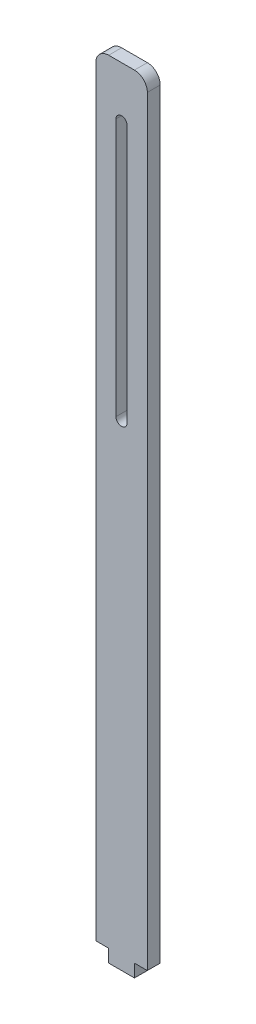
ISO-10303-21;
HEADER;
FILE_DESCRIPTION(('STEP AP214'),'2;1');
FILE_NAME('part.step','',(''),(''),'','','');
FILE_SCHEMA(('AUTOMOTIVE_DESIGN { 1 0 10303 214 1 1 1 1 }'));
ENDSEC;
DATA;
#1=APPLICATION_CONTEXT('core data for automotive mechanical design processes');
#2=APPLICATION_PROTOCOL_DEFINITION('international standard','automotive_design',2000,#1);
#3=PRODUCT_CONTEXT('',#1,'mechanical');
#4=PRODUCT('Part','Part','',(#3));
#5=PRODUCT_RELATED_PRODUCT_CATEGORY('part','',(#4));
#6=PRODUCT_DEFINITION_FORMATION('','',#4);
#7=PRODUCT_DEFINITION_CONTEXT('part definition',#1,'design');
#8=PRODUCT_DEFINITION('design','',#6,#7);
#9=PRODUCT_DEFINITION_SHAPE('','',#8);
#10=(LENGTH_UNIT() NAMED_UNIT(*) SI_UNIT(.MILLI.,.METRE.));
#11=(NAMED_UNIT(*) PLANE_ANGLE_UNIT() SI_UNIT($,.RADIAN.));
#12=(NAMED_UNIT(*) SI_UNIT($,.STERADIAN.) SOLID_ANGLE_UNIT());
#13=UNCERTAINTY_MEASURE_WITH_UNIT(LENGTH_MEASURE(1.E-05),#10,'distance_accuracy_value','');
#14=(GEOMETRIC_REPRESENTATION_CONTEXT(3) GLOBAL_UNCERTAINTY_ASSIGNED_CONTEXT((#13)) GLOBAL_UNIT_ASSIGNED_CONTEXT((#10,
#11,#12)) REPRESENTATION_CONTEXT('',''));
#15=CARTESIAN_POINT('',(0.,0.,0.));
#16=DIRECTION('',(0.,0.,1.));
#17=DIRECTION('',(1.,0.,0.));
#18=AXIS2_PLACEMENT_3D('',#15,#16,#17);
#19=CARTESIAN_POINT('',(12.7,190.5,6.35));
#20=DIRECTION('',(-1.,0.,0.));
#21=DIRECTION('',(0.,-1.,0.));
#22=AXIS2_PLACEMENT_3D('',#19,#20,#21);
#23=PLANE('',#22);
#24=DIRECTION('',(0.,1.,0.));
#25=VECTOR('',#24,1.);
#26=CARTESIAN_POINT('',(12.7,190.5,0.));
#27=LINE('',#26,#25);
#28=CARTESIAN_POINT('',(12.7,-190.5,0.));
#29=VERTEX_POINT('',#28);
#30=CARTESIAN_POINT('',(12.7,184.15,0.));
#31=VERTEX_POINT('',#30);
#32=EDGE_CURVE('E180',#29,#31,#27,.T.);
#33=ORIENTED_EDGE('',*,*,#32,.T.);
#34=DIRECTION('',(0.,0.,-1.));
#35=VECTOR('',#34,1.);
#36=CARTESIAN_POINT('',(12.7,184.15,6.35));
#37=LINE('',#36,#35);
#38=CARTESIAN_POINT('',(12.7,184.15,6.35));
#39=VERTEX_POINT('',#38);
#40=EDGE_CURVE('E11',#31,#39,#37,.F.);
#41=ORIENTED_EDGE('',*,*,#40,.T.);
#42=DIRECTION('',(0.,1.,0.));
#43=VECTOR('',#42,1.);
#44=CARTESIAN_POINT('',(12.7,190.5,6.35));
#45=LINE('',#44,#43);
#46=CARTESIAN_POINT('',(12.7,-190.5,6.35));
#47=VERTEX_POINT('',#46);
#48=EDGE_CURVE('E184',#47,#39,#45,.T.);
#49=ORIENTED_EDGE('',*,*,#48,.F.);
#50=DIRECTION('',(0.,0.,-1.));
#51=VECTOR('',#50,1.);
#52=CARTESIAN_POINT('',(12.7,-190.5,6.35));
#53=LINE('',#52,#51);
#54=EDGE_CURVE('E201',#47,#29,#53,.T.);
#55=ORIENTED_EDGE('',*,*,#54,.T.);
#56=EDGE_LOOP('',(#33,#41,#49,#55));
#57=FACE_BOUND('',#56,.T.);
#58=ADVANCED_FACE('F37',(#57),#23,.F.);
#59=CARTESIAN_POINT('',(-12.7,190.5,6.35));
#60=DIRECTION('',(0.,-1.,0.));
#61=DIRECTION('',(0.,0.,-1.));
#62=AXIS2_PLACEMENT_3D('',#59,#60,#61);
#63=PLANE('',#62);
#64=DIRECTION('',(-1.,0.,0.));
#65=VECTOR('',#64,1.);
#66=CARTESIAN_POINT('',(-12.7,190.5,0.));
#67=LINE('',#66,#65);
#68=CARTESIAN_POINT('',(6.34999999999997,190.5,0.));
#69=VERTEX_POINT('',#68);
#70=CARTESIAN_POINT('',(-6.35000000000002,190.5,0.));
#71=VERTEX_POINT('',#70);
#72=EDGE_CURVE('E203',#69,#71,#67,.T.);
#73=ORIENTED_EDGE('',*,*,#72,.T.);
#74=DIRECTION('',(0.,0.,-1.));
#75=VECTOR('',#74,1.);
#76=CARTESIAN_POINT('',(-6.35000000000002,190.5,6.35));
#77=LINE('',#76,#75);
#78=CARTESIAN_POINT('',(-6.35000000000002,190.5,6.35));
#79=VERTEX_POINT('',#78);
#80=EDGE_CURVE('E58',#71,#79,#77,.F.);
#81=ORIENTED_EDGE('',*,*,#80,.T.);
#82=DIRECTION('',(-1.,0.,0.));
#83=VECTOR('',#82,1.);
#84=CARTESIAN_POINT('',(-12.7,190.5,6.35));
#85=LINE('',#84,#83);
#86=CARTESIAN_POINT('',(6.34999999999997,190.5,6.35));
#87=VERTEX_POINT('',#86);
#88=EDGE_CURVE('E186',#87,#79,#85,.T.);
#89=ORIENTED_EDGE('',*,*,#88,.F.);
#90=DIRECTION('',(0.,0.,-1.));
#91=VECTOR('',#90,1.);
#92=CARTESIAN_POINT('',(6.34999999999997,190.5,6.35));
#93=LINE('',#92,#91);
#94=EDGE_CURVE('E240',#87,#69,#93,.T.);
#95=ORIENTED_EDGE('',*,*,#94,.T.);
#96=EDGE_LOOP('',(#73,#81,#89,#95));
#97=FACE_BOUND('',#96,.T.);
#98=ADVANCED_FACE('F259',(#97),#63,.F.);
#99=CARTESIAN_POINT('',(-12.7,190.5,6.35));
#100=DIRECTION('',(1.,0.,0.));
#101=DIRECTION('',(0.,1.,0.));
#102=AXIS2_PLACEMENT_3D('',#99,#100,#101);
#103=PLANE('',#102);
#104=DIRECTION('',(0.,-1.,0.));
#105=VECTOR('',#104,1.);
#106=CARTESIAN_POINT('',(-12.7,190.5,6.35));
#107=LINE('',#106,#105);
#108=CARTESIAN_POINT('',(-12.7,184.15,6.35));
#109=VERTEX_POINT('',#108);
#110=CARTESIAN_POINT('',(-12.7,-190.5,6.35));
#111=VERTEX_POINT('',#110);
#112=EDGE_CURVE('E189',#109,#111,#107,.T.);
#113=ORIENTED_EDGE('',*,*,#112,.F.);
#114=DIRECTION('',(0.,0.,-1.));
#115=VECTOR('',#114,1.);
#116=CARTESIAN_POINT('',(-12.7,184.15,6.35));
#117=LINE('',#116,#115);
#118=CARTESIAN_POINT('',(-12.7,184.15,0.));
#119=VERTEX_POINT('',#118);
#120=EDGE_CURVE('E233',#109,#119,#117,.T.);
#121=ORIENTED_EDGE('',*,*,#120,.T.);
#122=DIRECTION('',(0.,-1.,0.));
#123=VECTOR('',#122,1.);
#124=CARTESIAN_POINT('',(-12.7,190.5,0.));
#125=LINE('',#124,#123);
#126=CARTESIAN_POINT('',(-12.7,-190.5,0.));
#127=VERTEX_POINT('',#126);
#128=EDGE_CURVE('E205',#119,#127,#125,.T.);
#129=ORIENTED_EDGE('',*,*,#128,.T.);
#130=DIRECTION('',(0.,0.,-1.));
#131=VECTOR('',#130,1.);
#132=CARTESIAN_POINT('',(-12.7,-190.5,6.35));
#133=LINE('',#132,#131);
#134=EDGE_CURVE('E230',#111,#127,#133,.T.);
#135=ORIENTED_EDGE('',*,*,#134,.F.);
#136=EDGE_LOOP('',(#113,#121,#129,#135));
#137=FACE_BOUND('',#136,.T.);
#138=ADVANCED_FACE('F253',(#137),#103,.F.);
#139=CARTESIAN_POINT('',(-12.7,-190.5,6.35));
#140=DIRECTION('',(0.,1.,0.));
#141=DIRECTION('',(0.,0.,1.));
#142=AXIS2_PLACEMENT_3D('',#139,#140,#141);
#143=PLANE('',#142);
#144=DIRECTION('',(1.,0.,0.));
#145=VECTOR('',#144,1.);
#146=CARTESIAN_POINT('',(-12.7,-190.5,0.));
#147=LINE('',#146,#145);
#148=CARTESIAN_POINT('',(-6.34999999999998,-190.5,0.));
#149=VERTEX_POINT('',#148);
#150=EDGE_CURVE('E207',#127,#149,#147,.T.);
#151=ORIENTED_EDGE('',*,*,#150,.T.);
#152=DIRECTION('',(0.,0.,-1.));
#153=VECTOR('',#152,1.);
#154=CARTESIAN_POINT('',(-6.34999999999998,-190.5,6.35));
#155=LINE('',#154,#153);
#156=CARTESIAN_POINT('',(-6.34999999999998,-190.5,6.35));
#157=VERTEX_POINT('',#156);
#158=EDGE_CURVE('E227',#157,#149,#155,.T.);
#159=ORIENTED_EDGE('',*,*,#158,.F.);
#160=DIRECTION('',(1.,0.,0.));
#161=VECTOR('',#160,1.);
#162=CARTESIAN_POINT('',(-12.7,-190.5,6.35));
#163=LINE('',#162,#161);
#164=EDGE_CURVE('E191',#111,#157,#163,.T.);
#165=ORIENTED_EDGE('',*,*,#164,.F.);
#166=ORIENTED_EDGE('',*,*,#134,.T.);
#167=EDGE_LOOP('',(#151,#159,#165,#166));
#168=FACE_BOUND('',#167,.T.);
#169=ADVANCED_FACE('F286',(#168),#143,.F.);
#170=CARTESIAN_POINT('',(-6.34999999999998,-190.5,6.35));
#171=DIRECTION('',(1.,0.,0.));
#172=DIRECTION('',(0.,0.,-1.));
#173=AXIS2_PLACEMENT_3D('',#170,#171,#172);
#174=PLANE('',#173);
#175=DIRECTION('',(0.,-1.,0.));
#176=VECTOR('',#175,1.);
#177=CARTESIAN_POINT('',(-6.34999999999998,-190.5,0.));
#178=LINE('',#177,#176);
#179=CARTESIAN_POINT('',(-6.34999999999998,-196.85,0.));
#180=VERTEX_POINT('',#179);
#181=EDGE_CURVE('E209',#149,#180,#178,.T.);
#182=ORIENTED_EDGE('',*,*,#181,.T.);
#183=DIRECTION('',(0.,0.,-1.));
#184=VECTOR('',#183,1.);
#185=CARTESIAN_POINT('',(-6.34999999999998,-196.85,6.35));
#186=LINE('',#185,#184);
#187=CARTESIAN_POINT('',(-6.34999999999998,-196.85,6.35));
#188=VERTEX_POINT('',#187);
#189=EDGE_CURVE('E224',#188,#180,#186,.T.);
#190=ORIENTED_EDGE('',*,*,#189,.F.);
#191=DIRECTION('',(0.,-1.,0.));
#192=VECTOR('',#191,1.);
#193=CARTESIAN_POINT('',(-6.34999999999998,-190.5,6.35));
#194=LINE('',#193,#192);
#195=EDGE_CURVE('E193',#157,#188,#194,.T.);
#196=ORIENTED_EDGE('',*,*,#195,.F.);
#197=ORIENTED_EDGE('',*,*,#158,.T.);
#198=EDGE_LOOP('',(#182,#190,#196,#197));
#199=FACE_BOUND('',#198,.T.);
#200=ADVANCED_FACE('F283',(#199),#174,.F.);
#201=CARTESIAN_POINT('',(-6.34999999999998,-196.85,6.35));
#202=DIRECTION('',(0.,1.,0.));
#203=DIRECTION('',(0.,0.,1.));
#204=AXIS2_PLACEMENT_3D('',#201,#202,#203);
#205=PLANE('',#204);
#206=DIRECTION('',(1.,0.,0.));
#207=VECTOR('',#206,1.);
#208=CARTESIAN_POINT('',(-6.34999999999998,-196.85,0.));
#209=LINE('',#208,#207);
#210=CARTESIAN_POINT('',(6.35000000000002,-196.85,0.));
#211=VERTEX_POINT('',#210);
#212=EDGE_CURVE('E211',#180,#211,#209,.T.);
#213=ORIENTED_EDGE('',*,*,#212,.T.);
#214=DIRECTION('',(0.,0.,-1.));
#215=VECTOR('',#214,1.);
#216=CARTESIAN_POINT('',(6.35000000000002,-196.85,6.35));
#217=LINE('',#216,#215);
#218=CARTESIAN_POINT('',(6.35000000000002,-196.85,6.35));
#219=VERTEX_POINT('',#218);
#220=EDGE_CURVE('E221',#219,#211,#217,.T.);
#221=ORIENTED_EDGE('',*,*,#220,.F.);
#222=DIRECTION('',(1.,0.,0.));
#223=VECTOR('',#222,1.);
#224=CARTESIAN_POINT('',(-6.34999999999998,-196.85,6.35));
#225=LINE('',#224,#223);
#226=EDGE_CURVE('E195',#188,#219,#225,.T.);
#227=ORIENTED_EDGE('',*,*,#226,.F.);
#228=ORIENTED_EDGE('',*,*,#189,.T.);
#229=EDGE_LOOP('',(#213,#221,#227,#228));
#230=FACE_BOUND('',#229,.T.);
#231=ADVANCED_FACE('F279',(#230),#205,.F.);
#232=CARTESIAN_POINT('',(6.35000000000002,-190.5,6.35));
#233=DIRECTION('',(-1.,0.,0.));
#234=DIRECTION('',(0.,-1.,0.));
#235=AXIS2_PLACEMENT_3D('',#232,#233,#234);
#236=PLANE('',#235);
#237=DIRECTION('',(0.,1.,0.));
#238=VECTOR('',#237,1.);
#239=CARTESIAN_POINT('',(6.35000000000002,-190.5,0.));
#240=LINE('',#239,#238);
#241=CARTESIAN_POINT('',(6.35000000000002,-190.5,0.));
#242=VERTEX_POINT('',#241);
#243=EDGE_CURVE('E213',#211,#242,#240,.T.);
#244=ORIENTED_EDGE('',*,*,#243,.T.);
#245=DIRECTION('',(0.,0.,-1.));
#246=VECTOR('',#245,1.);
#247=CARTESIAN_POINT('',(6.35000000000002,-190.5,6.35));
#248=LINE('',#247,#246);
#249=CARTESIAN_POINT('',(6.35000000000002,-190.5,6.35));
#250=VERTEX_POINT('',#249);
#251=EDGE_CURVE('E218',#250,#242,#248,.T.);
#252=ORIENTED_EDGE('',*,*,#251,.F.);
#253=DIRECTION('',(0.,1.,0.));
#254=VECTOR('',#253,1.);
#255=CARTESIAN_POINT('',(6.35000000000002,-190.5,6.35));
#256=LINE('',#255,#254);
#257=EDGE_CURVE('E197',#219,#250,#256,.T.);
#258=ORIENTED_EDGE('',*,*,#257,.F.);
#259=ORIENTED_EDGE('',*,*,#220,.T.);
#260=EDGE_LOOP('',(#244,#252,#258,#259));
#261=FACE_BOUND('',#260,.T.);
#262=ADVANCED_FACE('F274',(#261),#236,.F.);
#263=CARTESIAN_POINT('',(6.35000000000002,-190.5,6.35));
#264=DIRECTION('',(0.,1.,0.));
#265=DIRECTION('',(-1.,0.,0.));
#266=AXIS2_PLACEMENT_3D('',#263,#264,#265);
#267=PLANE('',#266);
#268=DIRECTION('',(1.,0.,0.));
#269=VECTOR('',#268,1.);
#270=CARTESIAN_POINT('',(6.35000000000002,-190.5,0.));
#271=LINE('',#270,#269);
#272=EDGE_CURVE('E187',#242,#29,#271,.T.);
#273=ORIENTED_EDGE('',*,*,#272,.T.);
#274=ORIENTED_EDGE('',*,*,#54,.F.);
#275=DIRECTION('',(1.,0.,0.));
#276=VECTOR('',#275,1.);
#277=CARTESIAN_POINT('',(6.35000000000002,-190.5,6.35));
#278=LINE('',#277,#276);
#279=EDGE_CURVE('E199',#250,#47,#278,.T.);
#280=ORIENTED_EDGE('',*,*,#279,.F.);
#281=ORIENTED_EDGE('',*,*,#251,.T.);
#282=EDGE_LOOP('',(#273,#274,#280,#281));
#283=FACE_BOUND('',#282,.T.);
#284=ADVANCED_FACE('F268',(#283),#267,.F.);
#285=CARTESIAN_POINT('',(0.,0.,6.35));
#286=DIRECTION('',(0.,0.,1.));
#287=DIRECTION('',(1.,0.,0.));
#288=AXIS2_PLACEMENT_3D('',#285,#286,#287);
#289=PLANE('',#288);
#290=CARTESIAN_POINT('',(0.,165.1,6.35));
#291=DIRECTION('',(0.,0.,1.));
#292=DIRECTION('',(1.,0.,0.));
#293=AXIS2_PLACEMENT_3D('',#290,#291,#292);
#294=CIRCLE('',#293,2.75);
#295=CARTESIAN_POINT('',(2.75,165.1,6.35));
#296=VERTEX_POINT('',#295);
#297=CARTESIAN_POINT('',(-2.75,165.1,6.35));
#298=VERTEX_POINT('',#297);
#299=EDGE_CURVE('E147',#296,#298,#294,.T.);
#300=ORIENTED_EDGE('',*,*,#299,.F.);
#301=DIRECTION('',(0.,1.,0.));
#302=VECTOR('',#301,1.);
#303=CARTESIAN_POINT('',(2.75,165.1,6.35));
#304=LINE('',#303,#302);
#305=CARTESIAN_POINT('',(2.75000000000002,38.1,6.35));
#306=VERTEX_POINT('',#305);
#307=EDGE_CURVE('E165',#306,#296,#304,.T.);
#308=ORIENTED_EDGE('',*,*,#307,.F.);
#309=CARTESIAN_POINT('',(0.,38.1,6.35));
#310=DIRECTION('',(0.,0.,1.));
#311=DIRECTION('',(1.,0.,0.));
#312=AXIS2_PLACEMENT_3D('',#309,#310,#311);
#313=CIRCLE('',#312,2.75);
#314=CARTESIAN_POINT('',(-2.74999999999998,38.1,6.35));
#315=VERTEX_POINT('',#314);
#316=EDGE_CURVE('E168',#315,#306,#313,.T.);
#317=ORIENTED_EDGE('',*,*,#316,.F.);
#318=DIRECTION('',(0.,-1.,0.));
#319=VECTOR('',#318,1.);
#320=CARTESIAN_POINT('',(-2.75,165.1,6.35));
#321=LINE('',#320,#319);
#322=EDGE_CURVE('E174',#298,#315,#321,.T.);
#323=ORIENTED_EDGE('',*,*,#322,.F.);
#324=EDGE_LOOP('',(#300,#308,#317,#323));
#325=FACE_BOUND('',#324,.T.);
#326=ORIENTED_EDGE('',*,*,#88,.T.);
#327=CARTESIAN_POINT('',(-6.35000000000002,184.15,6.35));
#328=DIRECTION('',(0.,0.,1.));
#329=DIRECTION('',(1.,0.,0.));
#330=AXIS2_PLACEMENT_3D('',#327,#328,#329);
#331=CIRCLE('',#330,6.35);
#332=EDGE_CURVE('E45',#79,#109,#331,.T.);
#333=ORIENTED_EDGE('',*,*,#332,.T.);
#334=ORIENTED_EDGE('',*,*,#112,.T.);
#335=ORIENTED_EDGE('',*,*,#164,.T.);
#336=ORIENTED_EDGE('',*,*,#195,.T.);
#337=ORIENTED_EDGE('',*,*,#226,.T.);
#338=ORIENTED_EDGE('',*,*,#257,.T.);
#339=ORIENTED_EDGE('',*,*,#279,.T.);
#340=ORIENTED_EDGE('',*,*,#48,.T.);
#341=CARTESIAN_POINT('',(6.34999999999997,184.15,6.35));
#342=DIRECTION('',(0.,0.,1.));
#343=DIRECTION('',(1.,0.,0.));
#344=AXIS2_PLACEMENT_3D('',#341,#342,#343);
#345=CIRCLE('',#344,6.35);
#346=EDGE_CURVE('E244',#39,#87,#345,.T.);
#347=ORIENTED_EDGE('',*,*,#346,.T.);
#348=EDGE_LOOP('',(#326,#333,#334,#335,#336,#337,#338,#339,#340,#347));
#349=FACE_BOUND('',#348,.T.);
#350=ADVANCED_FACE('F248',(#325,#349),#289,.T.);
#351=CARTESIAN_POINT('',(0.,0.,0.));
#352=DIRECTION('',(0.,0.,1.));
#353=DIRECTION('',(1.,0.,0.));
#354=AXIS2_PLACEMENT_3D('',#351,#352,#353);
#355=PLANE('',#354);
#356=DIRECTION('',(0.,1.,0.));
#357=VECTOR('',#356,1.);
#358=CARTESIAN_POINT('',(2.75,165.1,0.));
#359=LINE('',#358,#357);
#360=CARTESIAN_POINT('',(2.75000000000002,38.1,0.));
#361=VERTEX_POINT('',#360);
#362=CARTESIAN_POINT('',(2.75,165.1,0.));
#363=VERTEX_POINT('',#362);
#364=EDGE_CURVE('E152',#361,#363,#359,.T.);
#365=ORIENTED_EDGE('',*,*,#364,.T.);
#366=CARTESIAN_POINT('',(0.,165.1,0.));
#367=DIRECTION('',(0.,0.,1.));
#368=DIRECTION('',(1.,0.,0.));
#369=AXIS2_PLACEMENT_3D('',#366,#367,#368);
#370=CIRCLE('',#369,2.75);
#371=CARTESIAN_POINT('',(-2.75,165.1,0.));
#372=VERTEX_POINT('',#371);
#373=EDGE_CURVE('E144',#363,#372,#370,.T.);
#374=ORIENTED_EDGE('',*,*,#373,.T.);
#375=DIRECTION('',(0.,-1.,0.));
#376=VECTOR('',#375,1.);
#377=CARTESIAN_POINT('',(-2.75,165.1,0.));
#378=LINE('',#377,#376);
#379=CARTESIAN_POINT('',(-2.74999999999998,38.1,0.));
#380=VERTEX_POINT('',#379);
#381=EDGE_CURVE('E156',#372,#380,#378,.T.);
#382=ORIENTED_EDGE('',*,*,#381,.T.);
#383=CARTESIAN_POINT('',(0.,38.1,0.));
#384=DIRECTION('',(0.,0.,1.));
#385=DIRECTION('',(1.,0.,0.));
#386=AXIS2_PLACEMENT_3D('',#383,#384,#385);
#387=CIRCLE('',#386,2.75);
#388=EDGE_CURVE('E160',#380,#361,#387,.T.);
#389=ORIENTED_EDGE('',*,*,#388,.T.);
#390=EDGE_LOOP('',(#365,#374,#382,#389));
#391=FACE_BOUND('',#390,.T.);
#392=ORIENTED_EDGE('',*,*,#128,.F.);
#393=CARTESIAN_POINT('',(-6.35000000000002,184.15,0.));
#394=DIRECTION('',(0.,0.,1.));
#395=DIRECTION('',(1.,0.,0.));
#396=AXIS2_PLACEMENT_3D('',#393,#394,#395);
#397=CIRCLE('',#396,6.35);
#398=EDGE_CURVE('E238',#119,#71,#397,.F.);
#399=ORIENTED_EDGE('',*,*,#398,.T.);
#400=ORIENTED_EDGE('',*,*,#72,.F.);
#401=CARTESIAN_POINT('',(6.34999999999997,184.15,0.));
#402=DIRECTION('',(0.,0.,1.));
#403=DIRECTION('',(1.,0.,0.));
#404=AXIS2_PLACEMENT_3D('',#401,#402,#403);
#405=CIRCLE('',#404,6.35);
#406=EDGE_CURVE('E236',#69,#31,#405,.F.);
#407=ORIENTED_EDGE('',*,*,#406,.T.);
#408=ORIENTED_EDGE('',*,*,#32,.F.);
#409=ORIENTED_EDGE('',*,*,#272,.F.);
#410=ORIENTED_EDGE('',*,*,#243,.F.);
#411=ORIENTED_EDGE('',*,*,#212,.F.);
#412=ORIENTED_EDGE('',*,*,#181,.F.);
#413=ORIENTED_EDGE('',*,*,#150,.F.);
#414=EDGE_LOOP('',(#392,#399,#400,#407,#408,#409,#410,#411,#412,#413));
#415=FACE_BOUND('',#414,.T.);
#416=ADVANCED_FACE('F162',(#391,#415),#355,.F.);
#417=CARTESIAN_POINT('',(0.,165.1,0.));
#418=DIRECTION('',(0.,0.,1.));
#419=DIRECTION('',(1.,0.,0.));
#420=AXIS2_PLACEMENT_3D('',#417,#418,#419);
#421=CYLINDRICAL_SURFACE('',#420,2.75);
#422=ORIENTED_EDGE('',*,*,#299,.T.);
#423=DIRECTION('',(0.,0.,1.));
#424=VECTOR('',#423,1.);
#425=CARTESIAN_POINT('',(-2.75,165.1,0.));
#426=LINE('',#425,#424);
#427=EDGE_CURVE('E140',#372,#298,#426,.T.);
#428=ORIENTED_EDGE('',*,*,#427,.F.);
#429=ORIENTED_EDGE('',*,*,#373,.F.);
#430=DIRECTION('',(0.,0.,1.));
#431=VECTOR('',#430,1.);
#432=CARTESIAN_POINT('',(2.75,165.1,0.));
#433=LINE('',#432,#431);
#434=EDGE_CURVE('E178',#363,#296,#433,.T.);
#435=ORIENTED_EDGE('',*,*,#434,.T.);
#436=EDGE_LOOP('',(#422,#428,#429,#435));
#437=FACE_BOUND('',#436,.T.);
#438=ADVANCED_FACE('F142',(#437),#421,.F.);
#439=CARTESIAN_POINT('',(2.75,165.1,0.));
#440=DIRECTION('',(1.,0.,0.));
#441=DIRECTION('',(0.,1.,0.));
#442=AXIS2_PLACEMENT_3D('',#439,#440,#441);
#443=PLANE('',#442);
#444=ORIENTED_EDGE('',*,*,#307,.T.);
#445=ORIENTED_EDGE('',*,*,#434,.F.);
#446=ORIENTED_EDGE('',*,*,#364,.F.);
#447=DIRECTION('',(0.,0.,1.));
#448=VECTOR('',#447,1.);
#449=CARTESIAN_POINT('',(2.75000000000002,38.1,0.));
#450=LINE('',#449,#448);
#451=EDGE_CURVE('E181',#361,#306,#450,.T.);
#452=ORIENTED_EDGE('',*,*,#451,.T.);
#453=EDGE_LOOP('',(#444,#445,#446,#452));
#454=FACE_BOUND('',#453,.T.);
#455=ADVANCED_FACE('F311',(#454),#443,.F.);
#456=CARTESIAN_POINT('',(0.,38.1,0.));
#457=DIRECTION('',(0.,0.,1.));
#458=DIRECTION('',(1.,0.,0.));
#459=AXIS2_PLACEMENT_3D('',#456,#457,#458);
#460=CYLINDRICAL_SURFACE('',#459,2.75);
#461=ORIENTED_EDGE('',*,*,#316,.T.);
#462=ORIENTED_EDGE('',*,*,#451,.F.);
#463=ORIENTED_EDGE('',*,*,#388,.F.);
#464=DIRECTION('',(0.,0.,1.));
#465=VECTOR('',#464,1.);
#466=CARTESIAN_POINT('',(-2.74999999999998,38.1,0.));
#467=LINE('',#466,#465);
#468=EDGE_CURVE('E151',#380,#315,#467,.T.);
#469=ORIENTED_EDGE('',*,*,#468,.T.);
#470=EDGE_LOOP('',(#461,#462,#463,#469));
#471=FACE_BOUND('',#470,.T.);
#472=ADVANCED_FACE('F306',(#471),#460,.F.);
#473=CARTESIAN_POINT('',(-2.75,165.1,0.));
#474=DIRECTION('',(-1.,0.,0.));
#475=DIRECTION('',(0.,-1.,0.));
#476=AXIS2_PLACEMENT_3D('',#473,#474,#475);
#477=PLANE('',#476);
#478=ORIENTED_EDGE('',*,*,#322,.T.);
#479=ORIENTED_EDGE('',*,*,#468,.F.);
#480=ORIENTED_EDGE('',*,*,#381,.F.);
#481=ORIENTED_EDGE('',*,*,#427,.T.);
#482=EDGE_LOOP('',(#478,#479,#480,#481));
#483=FACE_BOUND('',#482,.T.);
#484=ADVANCED_FACE('F157',(#483),#477,.F.);
#485=CARTESIAN_POINT('',(-6.35000000000002,184.15,6.35));
#486=DIRECTION('',(0.,0.,-1.));
#487=DIRECTION('',(-1.,0.,0.));
#488=AXIS2_PLACEMENT_3D('',#485,#486,#487);
#489=CYLINDRICAL_SURFACE('',#488,6.35);
#490=ORIENTED_EDGE('',*,*,#332,.F.);
#491=ORIENTED_EDGE('',*,*,#80,.F.);
#492=ORIENTED_EDGE('',*,*,#398,.F.);
#493=ORIENTED_EDGE('',*,*,#120,.F.);
#494=EDGE_LOOP('',(#490,#491,#492,#493));
#495=FACE_BOUND('',#494,.T.);
#496=ADVANCED_FACE('F256',(#495),#489,.T.);
#497=CARTESIAN_POINT('',(6.34999999999997,184.15,6.35));
#498=DIRECTION('',(0.,0.,-1.));
#499=DIRECTION('',(-1.,0.,0.));
#500=AXIS2_PLACEMENT_3D('',#497,#498,#499);
#501=CYLINDRICAL_SURFACE('',#500,6.35);
#502=ORIENTED_EDGE('',*,*,#346,.F.);
#503=ORIENTED_EDGE('',*,*,#40,.F.);
#504=ORIENTED_EDGE('',*,*,#406,.F.);
#505=ORIENTED_EDGE('',*,*,#94,.F.);
#506=EDGE_LOOP('',(#502,#503,#504,#505));
#507=FACE_BOUND('',#506,.T.);
#508=ADVANCED_FACE('F39',(#507),#501,.T.);
#509=CLOSED_SHELL('',(#58,#98,#138,#169,#200,#231,#262,#284,#350,#416,#438,#455,#472,#484,#496,#508));
#510=MANIFOLD_SOLID_BREP('B2',#509);
#511=ADVANCED_BREP_SHAPE_REPRESENTATION('',(#18,#510),#14);
#512=SHAPE_DEFINITION_REPRESENTATION(#9,#511);
ENDSEC;
END-ISO-10303-21;
